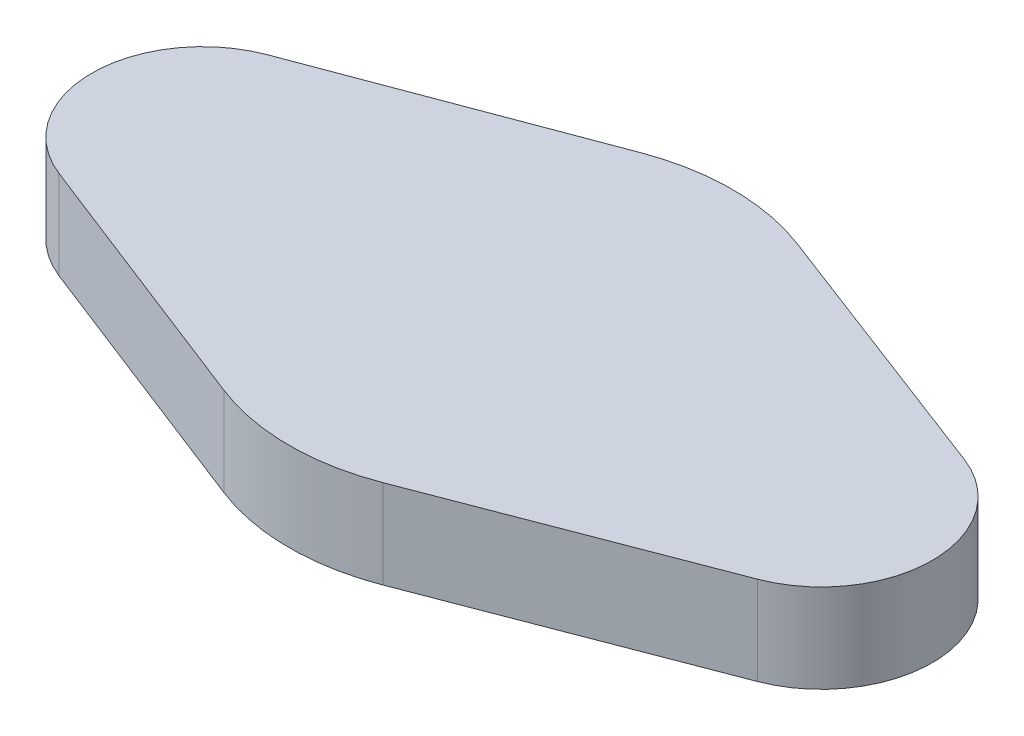
ISO-10303-21;
HEADER;
FILE_DESCRIPTION(('STEP AP214'),'2;1');
FILE_NAME('part.step','',(''),(''),'','','');
FILE_SCHEMA(('AUTOMOTIVE_DESIGN { 1 0 10303 214 1 1 1 1 }'));
ENDSEC;
DATA;
#1=APPLICATION_CONTEXT('core data for automotive mechanical design processes');
#2=APPLICATION_PROTOCOL_DEFINITION('international standard','automotive_design',2000,#1);
#3=PRODUCT_CONTEXT('',#1,'mechanical');
#4=PRODUCT('Part','Part','',(#3));
#5=PRODUCT_RELATED_PRODUCT_CATEGORY('part','',(#4));
#6=PRODUCT_DEFINITION_FORMATION('','',#4);
#7=PRODUCT_DEFINITION_CONTEXT('part definition',#1,'design');
#8=PRODUCT_DEFINITION('design','',#6,#7);
#9=PRODUCT_DEFINITION_SHAPE('','',#8);
#10=(LENGTH_UNIT() NAMED_UNIT(*) SI_UNIT(.MILLI.,.METRE.));
#11=(NAMED_UNIT(*) PLANE_ANGLE_UNIT() SI_UNIT($,.RADIAN.));
#12=(NAMED_UNIT(*) SI_UNIT($,.STERADIAN.) SOLID_ANGLE_UNIT());
#13=UNCERTAINTY_MEASURE_WITH_UNIT(LENGTH_MEASURE(1.E-05),#10,'distance_accuracy_value','');
#14=(GEOMETRIC_REPRESENTATION_CONTEXT(3) GLOBAL_UNCERTAINTY_ASSIGNED_CONTEXT((#13)) GLOBAL_UNIT_ASSIGNED_CONTEXT((#10,
#11,#12)) REPRESENTATION_CONTEXT('',''));
#15=CARTESIAN_POINT('',(0.,0.,0.));
#16=DIRECTION('',(0.,0.,1.));
#17=DIRECTION('',(1.,0.,0.));
#18=AXIS2_PLACEMENT_3D('',#15,#16,#17);
#19=CARTESIAN_POINT('',(69.9999921528156,-20.,-0.0331452222624423));
#20=DIRECTION('',(0.,1.,0.));
#21=DIRECTION('',(0.,0.,1.));
#22=AXIS2_PLACEMENT_3D('',#19,#20,#21);
#23=CYLINDRICAL_SURFACE('',#22,25.);
#24=CARTESIAN_POINT('',(69.9999921528156,0.,-0.0331452222624423));
#25=DIRECTION('',(0.,-1.,0.));
#26=DIRECTION('',(0.,0.,-1.));
#27=AXIS2_PLACEMENT_3D('',#24,#25,#26);
#28=CIRCLE('',#27,25.);
#29=CARTESIAN_POINT('',(78.9175056921311,0.,-23.3886146518441));
#30=VERTEX_POINT('',#29);
#31=CARTESIAN_POINT('',(78.9396194688102,0.,23.3138687934768));
#32=VERTEX_POINT('',#31);
#33=EDGE_CURVE('E133',#30,#32,#28,.T.);
#34=ORIENTED_EDGE('',*,*,#33,.T.);
#35=DIRECTION('',(0.,1.,0.));
#36=VECTOR('',#35,1.);
#37=CARTESIAN_POINT('',(78.9396194688102,-20.,23.3138687934768));
#38=LINE('',#37,#36);
#39=CARTESIAN_POINT('',(78.9396194688102,-20.,23.3138687934768));
#40=VERTEX_POINT('',#39);
#41=EDGE_CURVE('E11',#40,#32,#38,.T.);
#42=ORIENTED_EDGE('',*,*,#41,.F.);
#43=CARTESIAN_POINT('',(69.9999921528156,-20.,-0.0331452222624423));
#44=DIRECTION('',(0.,-1.,0.));
#45=DIRECTION('',(0.,0.,-1.));
#46=AXIS2_PLACEMENT_3D('',#43,#44,#45);
#47=CIRCLE('',#46,25.);
#48=CARTESIAN_POINT('',(78.9175056921311,-20.,-23.3886146518441));
#49=VERTEX_POINT('',#48);
#50=EDGE_CURVE('E147',#49,#40,#47,.T.);
#51=ORIENTED_EDGE('',*,*,#50,.F.);
#52=DIRECTION('',(0.,1.,0.));
#53=VECTOR('',#52,1.);
#54=CARTESIAN_POINT('',(78.9175056921311,-20.,-23.3886146518441));
#55=LINE('',#54,#53);
#56=EDGE_CURVE('E129',#49,#30,#55,.T.);
#57=ORIENTED_EDGE('',*,*,#56,.T.);
#58=EDGE_LOOP('',(#34,#42,#51,#57));
#59=FACE_BOUND('',#58,.T.);
#60=ADVANCED_FACE('F37',(#59),#23,.T.);
#61=CARTESIAN_POINT('',(17.8792546319892,-20.,46.6940280314785));
#62=DIRECTION('',(-0.357585092639783,0.,-0.933880560629569));
#63=DIRECTION('',(-0.933880560629569,0.,0.357585092639783));
#64=AXIS2_PLACEMENT_3D('',#61,#62,#63);
#65=PLANE('',#64);
#66=DIRECTION('',(-0.933880560629569,0.,0.357585092639783));
#67=VECTOR('',#66,1.);
#68=CARTESIAN_POINT('',(17.8792546319892,0.,46.6940280314785));
#69=LINE('',#68,#67);
#70=CARTESIAN_POINT('',(17.8792546319892,0.,46.6940280314785));
#71=VERTEX_POINT('',#70);
#72=EDGE_CURVE('E136',#32,#71,#69,.T.);
#73=ORIENTED_EDGE('',*,*,#72,.T.);
#74=DIRECTION('',(0.,1.,0.));
#75=VECTOR('',#74,1.);
#76=CARTESIAN_POINT('',(17.8792546319892,-20.,46.6940280314785));
#77=LINE('',#76,#75);
#78=CARTESIAN_POINT('',(17.8792546319892,-20.,46.6940280314785));
#79=VERTEX_POINT('',#78);
#80=EDGE_CURVE('E45',#79,#71,#77,.T.);
#81=ORIENTED_EDGE('',*,*,#80,.F.);
#82=DIRECTION('',(-0.933880560629569,0.,0.357585092639783));
#83=VECTOR('',#82,1.);
#84=CARTESIAN_POINT('',(17.8792546319892,-20.,46.6940280314785));
#85=LINE('',#84,#83);
#86=EDGE_CURVE('E96',#40,#79,#85,.T.);
#87=ORIENTED_EDGE('',*,*,#86,.F.);
#88=ORIENTED_EDGE('',*,*,#41,.T.);
#89=EDGE_LOOP('',(#73,#81,#87,#88));
#90=FACE_BOUND('',#89,.T.);
#91=ADVANCED_FACE('F182',(#90),#65,.F.);
#92=CARTESIAN_POINT('',(0.,-20.,0.));
#93=DIRECTION('',(0.,1.,0.));
#94=DIRECTION('',(0.,0.,1.));
#95=AXIS2_PLACEMENT_3D('',#92,#93,#94);
#96=CYLINDRICAL_SURFACE('',#95,50.);
#97=CARTESIAN_POINT('',(0.,0.,0.));
#98=DIRECTION('',(0.,-1.,0.));
#99=DIRECTION('',(0.,0.,-1.));
#100=AXIS2_PLACEMENT_3D('',#97,#98,#99);
#101=CIRCLE('',#100,50.);
#102=CARTESIAN_POINT('',(-18.1568826975564,0.,46.5867750623198));
#103=VERTEX_POINT('',#102);
#104=EDGE_CURVE('E138',#71,#103,#101,.T.);
#105=ORIENTED_EDGE('',*,*,#104,.T.);
#106=DIRECTION('',(0.,1.,0.));
#107=VECTOR('',#106,1.);
#108=CARTESIAN_POINT('',(-18.1568826975564,-20.,46.5867750623198));
#109=LINE('',#108,#107);
#110=CARTESIAN_POINT('',(-18.1568826975564,-20.,46.5867750623198));
#111=VERTEX_POINT('',#110);
#112=EDGE_CURVE('E154',#111,#103,#109,.T.);
#113=ORIENTED_EDGE('',*,*,#112,.F.);
#114=CARTESIAN_POINT('',(0.,-20.,0.));
#115=DIRECTION('',(0.,-1.,0.));
#116=DIRECTION('',(0.,0.,-1.));
#117=AXIS2_PLACEMENT_3D('',#114,#115,#116);
#118=CIRCLE('',#117,50.);
#119=EDGE_CURVE('E162',#79,#111,#118,.T.);
#120=ORIENTED_EDGE('',*,*,#119,.F.);
#121=ORIENTED_EDGE('',*,*,#80,.T.);
#122=EDGE_LOOP('',(#105,#113,#120,#121));
#123=FACE_BOUND('',#122,.T.);
#124=ADVANCED_FACE('F160',(#123),#96,.T.);
#125=CARTESIAN_POINT('',(-79.0769960781902,-20.,22.8435700198086));
#126=DIRECTION('',(0.363137653951129,0.,-0.931735501246395));
#127=DIRECTION('',(-0.931735501246395,0.,-0.363137653951129));
#128=AXIS2_PLACEMENT_3D('',#125,#126,#127);
#129=PLANE('',#128);
#130=DIRECTION('',(-0.931735501246395,0.,-0.363137653951129));
#131=VECTOR('',#130,1.);
#132=CARTESIAN_POINT('',(-79.0769960781902,0.,22.8435700198086));
#133=LINE('',#132,#131);
#134=CARTESIAN_POINT('',(-79.0769960781902,0.,22.8435700198086));
#135=VERTEX_POINT('',#134);
#136=EDGE_CURVE('E140',#103,#135,#133,.T.);
#137=ORIENTED_EDGE('',*,*,#136,.T.);
#138=DIRECTION('',(0.,1.,0.));
#139=VECTOR('',#138,1.);
#140=CARTESIAN_POINT('',(-79.0769960781902,-20.,22.8435700198086));
#141=LINE('',#140,#139);
#142=CARTESIAN_POINT('',(-79.0769960781902,-20.,22.8435700198086));
#143=VERTEX_POINT('',#142);
#144=EDGE_CURVE('E151',#143,#135,#141,.T.);
#145=ORIENTED_EDGE('',*,*,#144,.F.);
#146=DIRECTION('',(-0.931735501246395,0.,-0.363137653951129));
#147=VECTOR('',#146,1.);
#148=CARTESIAN_POINT('',(-79.0769960781902,-20.,22.8435700198086));
#149=LINE('',#148,#147);
#150=EDGE_CURVE('E174',#111,#143,#149,.T.);
#151=ORIENTED_EDGE('',*,*,#150,.F.);
#152=ORIENTED_EDGE('',*,*,#112,.T.);
#153=EDGE_LOOP('',(#137,#145,#151,#152));
#154=FACE_BOUND('',#153,.T.);
#155=ADVANCED_FACE('F170',(#154),#129,.F.);
#156=CARTESIAN_POINT('',(-69.998554729412,-20.,-0.449817511351326));
#157=DIRECTION('',(0.,1.,0.));
#158=DIRECTION('',(0.,0.,1.));
#159=AXIS2_PLACEMENT_3D('',#156,#157,#158);
#160=CYLINDRICAL_SURFACE('',#159,25.);
#161=CARTESIAN_POINT('',(-69.998554729412,0.,-0.449817511351326));
#162=DIRECTION('',(0.,-1.,0.));
#163=DIRECTION('',(0.,0.,-1.));
#164=AXIS2_PLACEMENT_3D('',#161,#162,#163);
#165=CIRCLE('',#164,25.);
#166=CARTESIAN_POINT('',(-78.7768875463001,0.,-23.8579544076518));
#167=VERTEX_POINT('',#166);
#168=EDGE_CURVE('E142',#135,#167,#165,.T.);
#169=ORIENTED_EDGE('',*,*,#168,.T.);
#170=DIRECTION('',(0.,1.,0.));
#171=VECTOR('',#170,1.);
#172=CARTESIAN_POINT('',(-78.7768875463001,-20.,-23.8579544076518));
#173=LINE('',#172,#171);
#174=CARTESIAN_POINT('',(-78.7768875463001,-20.,-23.8579544076518));
#175=VERTEX_POINT('',#174);
#176=EDGE_CURVE('E124',#175,#167,#173,.T.);
#177=ORIENTED_EDGE('',*,*,#176,.F.);
#178=CARTESIAN_POINT('',(-69.998554729412,-20.,-0.449817511351326));
#179=DIRECTION('',(0.,-1.,0.));
#180=DIRECTION('',(0.,0.,-1.));
#181=AXIS2_PLACEMENT_3D('',#178,#179,#180);
#182=CIRCLE('',#181,25.);
#183=EDGE_CURVE('E115',#143,#175,#182,.T.);
#184=ORIENTED_EDGE('',*,*,#183,.F.);
#185=ORIENTED_EDGE('',*,*,#144,.T.);
#186=EDGE_LOOP('',(#169,#177,#184,#185));
#187=FACE_BOUND('',#186,.T.);
#188=ADVANCED_FACE('F173',(#187),#160,.T.);
#189=CARTESIAN_POINT('',(-17.5566656337762,-20.,-46.816273792601));
#190=DIRECTION('',(0.351133312675524,0.,0.93632547585202));
#191=DIRECTION('',(0.93632547585202,0.,-0.351133312675524));
#192=AXIS2_PLACEMENT_3D('',#189,#190,#191);
#193=PLANE('',#192);
#194=DIRECTION('',(0.93632547585202,0.,-0.351133312675524));
#195=VECTOR('',#194,1.);
#196=CARTESIAN_POINT('',(-17.5566656337762,0.,-46.816273792601));
#197=LINE('',#196,#195);
#198=CARTESIAN_POINT('',(-17.5566656337762,0.,-46.816273792601));
#199=VERTEX_POINT('',#198);
#200=EDGE_CURVE('E123',#167,#199,#197,.T.);
#201=ORIENTED_EDGE('',*,*,#200,.T.);
#202=DIRECTION('',(0.,1.,0.));
#203=VECTOR('',#202,1.);
#204=CARTESIAN_POINT('',(-17.5566656337762,-20.,-46.816273792601));
#205=LINE('',#204,#203);
#206=CARTESIAN_POINT('',(-17.5566656337762,-20.,-46.816273792601));
#207=VERTEX_POINT('',#206);
#208=EDGE_CURVE('E120',#207,#199,#205,.T.);
#209=ORIENTED_EDGE('',*,*,#208,.F.);
#210=DIRECTION('',(0.93632547585202,0.,-0.351133312675524));
#211=VECTOR('',#210,1.);
#212=CARTESIAN_POINT('',(-17.5566656337762,-20.,-46.816273792601));
#213=LINE('',#212,#211);
#214=EDGE_CURVE('E109',#175,#207,#213,.T.);
#215=ORIENTED_EDGE('',*,*,#214,.F.);
#216=ORIENTED_EDGE('',*,*,#176,.T.);
#217=EDGE_LOOP('',(#201,#209,#215,#216));
#218=FACE_BOUND('',#217,.T.);
#219=ADVANCED_FACE('F121',(#218),#193,.F.);
#220=CARTESIAN_POINT('',(0.,-20.,0.));
#221=DIRECTION('',(0.,1.,0.));
#222=DIRECTION('',(0.,0.,1.));
#223=AXIS2_PLACEMENT_3D('',#220,#221,#222);
#224=CYLINDRICAL_SURFACE('',#223,50.);
#225=CARTESIAN_POINT('',(0.,0.,0.));
#226=DIRECTION('',(0.,-1.,0.));
#227=DIRECTION('',(0.,0.,-1.));
#228=AXIS2_PLACEMENT_3D('',#225,#226,#227);
#229=CIRCLE('',#228,50.);
#230=CARTESIAN_POINT('',(17.835027078631,0.,-46.7109388591634));
#231=VERTEX_POINT('',#230);
#232=EDGE_CURVE('E82',#199,#231,#229,.T.);
#233=ORIENTED_EDGE('',*,*,#232,.T.);
#234=DIRECTION('',(0.,1.,0.));
#235=VECTOR('',#234,1.);
#236=CARTESIAN_POINT('',(17.835027078631,-20.,-46.7109388591634));
#237=LINE('',#236,#235);
#238=CARTESIAN_POINT('',(17.835027078631,-20.,-46.7109388591634));
#239=VERTEX_POINT('',#238);
#240=EDGE_CURVE('E125',#239,#231,#237,.T.);
#241=ORIENTED_EDGE('',*,*,#240,.F.);
#242=CARTESIAN_POINT('',(0.,-20.,0.));
#243=DIRECTION('',(0.,-1.,0.));
#244=DIRECTION('',(0.,0.,-1.));
#245=AXIS2_PLACEMENT_3D('',#242,#243,#244);
#246=CIRCLE('',#245,50.);
#247=EDGE_CURVE('E113',#207,#239,#246,.T.);
#248=ORIENTED_EDGE('',*,*,#247,.F.);
#249=ORIENTED_EDGE('',*,*,#208,.T.);
#250=EDGE_LOOP('',(#233,#241,#248,#249));
#251=FACE_BOUND('',#250,.T.);
#252=ADVANCED_FACE('F127',(#251),#224,.T.);
#253=CARTESIAN_POINT('',(78.9175056921311,-20.,-23.3886146518441));
#254=DIRECTION('',(-0.35670054157262,0.,0.934218777183267));
#255=DIRECTION('',(0.934218777183267,0.,0.35670054157262));
#256=AXIS2_PLACEMENT_3D('',#253,#254,#255);
#257=PLANE('',#256);
#258=DIRECTION('',(0.934218777183267,0.,0.35670054157262));
#259=VECTOR('',#258,1.);
#260=CARTESIAN_POINT('',(78.9175056921311,0.,-23.3886146518441));
#261=LINE('',#260,#259);
#262=EDGE_CURVE('E88',#231,#30,#261,.T.);
#263=ORIENTED_EDGE('',*,*,#262,.T.);
#264=ORIENTED_EDGE('',*,*,#56,.F.);
#265=DIRECTION('',(0.934218777183267,0.,0.35670054157262));
#266=VECTOR('',#265,1.);
#267=CARTESIAN_POINT('',(78.9175056921311,-20.,-23.3886146518441));
#268=LINE('',#267,#266);
#269=EDGE_CURVE('E53',#239,#49,#268,.T.);
#270=ORIENTED_EDGE('',*,*,#269,.F.);
#271=ORIENTED_EDGE('',*,*,#240,.T.);
#272=EDGE_LOOP('',(#263,#264,#270,#271));
#273=FACE_BOUND('',#272,.T.);
#274=ADVANCED_FACE('F198',(#273),#257,.F.);
#275=CARTESIAN_POINT('',(69.9999921528156,-20.,-0.0331452222624423));
#276=DIRECTION('',(0.,-1.,0.));
#277=DIRECTION('',(0.,0.,-1.));
#278=AXIS2_PLACEMENT_3D('',#275,#276,#277);
#279=PLANE('',#278);
#280=ORIENTED_EDGE('',*,*,#50,.T.);
#281=ORIENTED_EDGE('',*,*,#86,.T.);
#282=ORIENTED_EDGE('',*,*,#119,.T.);
#283=ORIENTED_EDGE('',*,*,#150,.T.);
#284=ORIENTED_EDGE('',*,*,#183,.T.);
#285=ORIENTED_EDGE('',*,*,#214,.T.);
#286=ORIENTED_EDGE('',*,*,#247,.T.);
#287=ORIENTED_EDGE('',*,*,#269,.T.);
#288=EDGE_LOOP('',(#280,#281,#282,#283,#284,#285,#286,#287));
#289=FACE_BOUND('',#288,.T.);
#290=ADVANCED_FACE('F111',(#289),#279,.T.);
#291=CARTESIAN_POINT('',(69.9999921528156,0.,-0.0331452222624423));
#292=DIRECTION('',(0.,-1.,0.));
#293=DIRECTION('',(0.,0.,-1.));
#294=AXIS2_PLACEMENT_3D('',#291,#292,#293);
#295=PLANE('',#294);
#296=ORIENTED_EDGE('',*,*,#33,.F.);
#297=ORIENTED_EDGE('',*,*,#262,.F.);
#298=ORIENTED_EDGE('',*,*,#232,.F.);
#299=ORIENTED_EDGE('',*,*,#200,.F.);
#300=ORIENTED_EDGE('',*,*,#168,.F.);
#301=ORIENTED_EDGE('',*,*,#136,.F.);
#302=ORIENTED_EDGE('',*,*,#104,.F.);
#303=ORIENTED_EDGE('',*,*,#72,.F.);
#304=EDGE_LOOP('',(#296,#297,#298,#299,#300,#301,#302,#303));
#305=FACE_BOUND('',#304,.T.);
#306=ADVANCED_FACE('F166',(#305),#295,.F.);
#307=CLOSED_SHELL('',(#60,#91,#124,#155,#188,#219,#252,#274,#290,#306));
#308=MANIFOLD_SOLID_BREP('B2',#307);
#309=ADVANCED_BREP_SHAPE_REPRESENTATION('',(#18,#308),#14);
#310=SHAPE_DEFINITION_REPRESENTATION(#9,#309);
ENDSEC;
END-ISO-10303-21;
